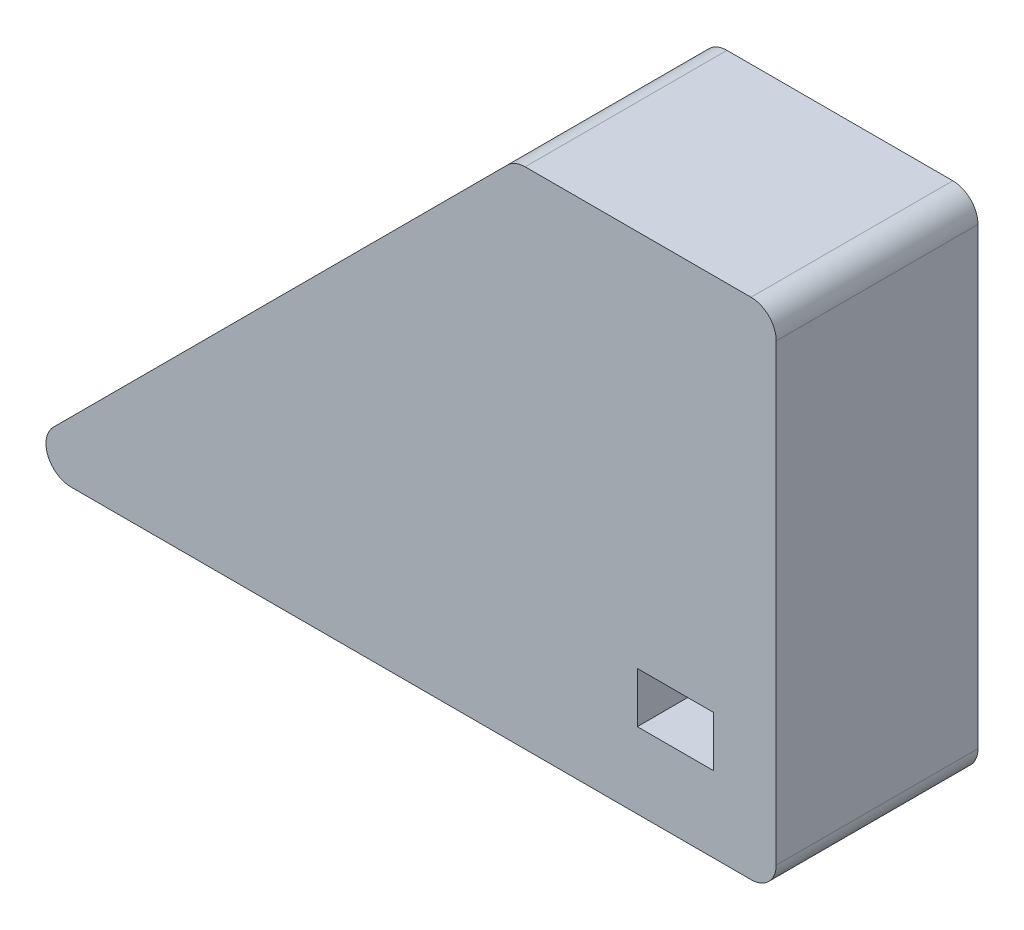
ISO-10303-21;
HEADER;
FILE_DESCRIPTION(('STEP AP214'),'2;1');
FILE_NAME('part.step','',(''),(''),'','','');
FILE_SCHEMA(('AUTOMOTIVE_DESIGN { 1 0 10303 214 1 1 1 1 }'));
ENDSEC;
DATA;
#1=APPLICATION_CONTEXT('core data for automotive mechanical design processes');
#2=APPLICATION_PROTOCOL_DEFINITION('international standard','automotive_design',2000,#1);
#3=PRODUCT_CONTEXT('',#1,'mechanical');
#4=PRODUCT('Part','Part','',(#3));
#5=PRODUCT_RELATED_PRODUCT_CATEGORY('part','',(#4));
#6=PRODUCT_DEFINITION_FORMATION('','',#4);
#7=PRODUCT_DEFINITION_CONTEXT('part definition',#1,'design');
#8=PRODUCT_DEFINITION('design','',#6,#7);
#9=PRODUCT_DEFINITION_SHAPE('','',#8);
#10=(LENGTH_UNIT() NAMED_UNIT(*) SI_UNIT(.MILLI.,.METRE.));
#11=(NAMED_UNIT(*) PLANE_ANGLE_UNIT() SI_UNIT($,.RADIAN.));
#12=(NAMED_UNIT(*) SI_UNIT($,.STERADIAN.) SOLID_ANGLE_UNIT());
#13=UNCERTAINTY_MEASURE_WITH_UNIT(LENGTH_MEASURE(1.E-05),#10,'distance_accuracy_value','');
#14=(GEOMETRIC_REPRESENTATION_CONTEXT(3) GLOBAL_UNCERTAINTY_ASSIGNED_CONTEXT((#13)) GLOBAL_UNIT_ASSIGNED_CONTEXT((#10,
#11,#12)) REPRESENTATION_CONTEXT('',''));
#15=CARTESIAN_POINT('',(0.,0.,0.));
#16=DIRECTION('',(0.,0.,1.));
#17=DIRECTION('',(1.,0.,0.));
#18=AXIS2_PLACEMENT_3D('',#15,#16,#17);
#19=CARTESIAN_POINT('',(13.87348,25.4,-12.7));
#20=DIRECTION('',(0.,-1.,0.));
#21=DIRECTION('',(1.,0.,0.));
#22=AXIS2_PLACEMENT_3D('',#19,#20,#21);
#23=CYLINDRICAL_SURFACE('',#22,2.4892);
#24=CARTESIAN_POINT('',(13.87348,0.,-12.7));
#25=DIRECTION('',(0.,-1.,0.));
#26=DIRECTION('',(1.,0.,0.));
#27=AXIS2_PLACEMENT_3D('',#24,#25,#26);
#28=CIRCLE('',#27,2.4892);
#29=CARTESIAN_POINT('',(16.36268,0.,-12.7));
#30=VERTEX_POINT('',#29);
#31=EDGE_CURVE('E204',#30,#30,#28,.T.);
#32=ORIENTED_EDGE('',*,*,#31,.T.);
#33=EDGE_LOOP('',(#32));
#34=FACE_BOUND('',#33,.T.);
#35=CARTESIAN_POINT('',(13.87348,8.89000000000004,-12.7));
#36=DIRECTION('',(0.,1.,0.));
#37=DIRECTION('',(0.,0.,1.));
#38=AXIS2_PLACEMENT_3D('',#35,#36,#37);
#39=CIRCLE('',#38,2.4892);
#40=CARTESIAN_POINT('',(13.87348,8.89000000000004,-10.2108));
#41=VERTEX_POINT('',#40);
#42=EDGE_CURVE('E246',#41,#41,#39,.F.);
#43=ORIENTED_EDGE('',*,*,#42,.F.);
#44=EDGE_LOOP('',(#43));
#45=FACE_BOUND('',#44,.T.);
#46=ADVANCED_FACE('F45',(#34,#45),#23,.F.);
#47=CARTESIAN_POINT('',(83.72348,25.4,-12.7));
#48=DIRECTION('',(0.,-1.,0.));
#49=DIRECTION('',(1.,0.,0.));
#50=AXIS2_PLACEMENT_3D('',#47,#48,#49);
#51=CYLINDRICAL_SURFACE('',#50,2.4892);
#52=CARTESIAN_POINT('',(83.72348,9.525,-12.7));
#53=DIRECTION('',(0.,-1.,0.));
#54=DIRECTION('',(0.,0.,-1.));
#55=AXIS2_PLACEMENT_3D('',#52,#53,#54);
#56=CIRCLE('',#55,2.4892);
#57=CARTESIAN_POINT('',(83.72348,9.525,-15.1892));
#58=VERTEX_POINT('',#57);
#59=EDGE_CURVE('E208',#58,#58,#56,.F.);
#60=ORIENTED_EDGE('',*,*,#59,.T.);
#61=EDGE_LOOP('',(#60));
#62=FACE_BOUND('',#61,.T.);
#63=CARTESIAN_POINT('',(83.72348,0.,-12.7));
#64=DIRECTION('',(0.,-1.,0.));
#65=DIRECTION('',(1.,0.,0.));
#66=AXIS2_PLACEMENT_3D('',#63,#64,#65);
#67=CIRCLE('',#66,2.4892);
#68=CARTESIAN_POINT('',(86.21268,0.,-12.7));
#69=VERTEX_POINT('',#68);
#70=EDGE_CURVE('E200',#69,#69,#67,.T.);
#71=ORIENTED_EDGE('',*,*,#70,.T.);
#72=EDGE_LOOP('',(#71));
#73=FACE_BOUND('',#72,.T.);
#74=ADVANCED_FACE('F337',(#62,#73),#51,.F.);
#75=CARTESIAN_POINT('',(96.42348,0.,-25.4));
#76=DIRECTION('',(0.,-1.,0.));
#77=DIRECTION('',(1.,0.,0.));
#78=AXIS2_PLACEMENT_3D('',#75,#76,#77);
#79=PLANE('',#78);
#80=ORIENTED_EDGE('',*,*,#70,.F.);
#81=EDGE_LOOP('',(#80));
#82=FACE_BOUND('',#81,.T.);
#83=ORIENTED_EDGE('',*,*,#31,.F.);
#84=EDGE_LOOP('',(#83));
#85=FACE_BOUND('',#84,.T.);
#86=DIRECTION('',(1.,0.,0.));
#87=VECTOR('',#86,1.);
#88=CARTESIAN_POINT('',(96.42348,0.,-25.4));
#89=LINE('',#88,#87);
#90=CARTESIAN_POINT('',(7.66512806053463,0.,-25.4));
#91=VERTEX_POINT('',#90);
#92=CARTESIAN_POINT('',(93.24848,0.,-25.4));
#93=VERTEX_POINT('',#92);
#94=EDGE_CURVE('E209',#91,#93,#89,.T.);
#95=ORIENTED_EDGE('',*,*,#94,.T.);
#96=DIRECTION('',(0.,0.,1.));
#97=VECTOR('',#96,1.);
#98=CARTESIAN_POINT('',(93.24848,0.,-25.4));
#99=LINE('',#98,#97);
#100=CARTESIAN_POINT('',(93.24848,0.,0.));
#101=VERTEX_POINT('',#100);
#102=EDGE_CURVE('E292',#93,#101,#99,.T.);
#103=ORIENTED_EDGE('',*,*,#102,.T.);
#104=DIRECTION('',(1.,0.,0.));
#105=VECTOR('',#104,1.);
#106=CARTESIAN_POINT('',(96.42348,0.,0.));
#107=LINE('',#106,#105);
#108=CARTESIAN_POINT('',(7.66512806053463,0.,0.));
#109=VERTEX_POINT('',#108);
#110=EDGE_CURVE('E199',#109,#101,#107,.T.);
#111=ORIENTED_EDGE('',*,*,#110,.F.);
#112=DIRECTION('',(0.,0.,1.));
#113=VECTOR('',#112,1.);
#114=CARTESIAN_POINT('',(7.66512806053463,0.,-25.4));
#115=LINE('',#114,#113);
#116=EDGE_CURVE('E289',#109,#91,#115,.F.);
#117=ORIENTED_EDGE('',*,*,#116,.T.);
#118=EDGE_LOOP('',(#95,#103,#111,#117));
#119=FACE_BOUND('',#118,.T.);
#120=ADVANCED_FACE('F299',(#82,#85,#119),#79,.T.);
#121=CARTESIAN_POINT('',(0.,0.,-25.4));
#122=DIRECTION('',(-0.707106781186544,0.707106781186551,0.));
#123=DIRECTION('',(-0.707106781186551,-0.707106781186544,0.));
#124=AXIS2_PLACEMENT_3D('',#121,#122,#123);
#125=PLANE('',#124);
#126=CARTESIAN_POINT('',(13.87348,13.8734799999999,-12.7));
#127=DIRECTION('',(-0.707106781186544,0.707106781186551,0.));
#128=DIRECTION('',(0.707106781186551,0.707106781186544,0.));
#129=AXIS2_PLACEMENT_3D('',#126,#127,#128);
#130=ELLIPSE('',#129,6.77111311528612,4.78790000000001);
#131=CARTESIAN_POINT('',(18.66138,18.6613799999998,-12.7));
#132=VERTEX_POINT('',#131);
#133=EDGE_CURVE('E180',#132,#132,#130,.T.);
#134=ORIENTED_EDGE('',*,*,#133,.F.);
#135=EDGE_LOOP('',(#134));
#136=FACE_BOUND('',#135,.T.);
#137=DIRECTION('',(-0.707106781186551,-0.707106781186544,0.));
#138=VECTOR('',#137,1.);
#139=CARTESIAN_POINT('',(0.,0.,-25.4));
#140=LINE('',#139,#138);
#141=CARTESIAN_POINT('',(62.570064030268,62.5700640302673,-25.4));
#142=VERTEX_POINT('',#141);
#143=CARTESIAN_POINT('',(5.42006403026736,5.4200640302673,-25.4));
#144=VERTEX_POINT('',#143);
#145=EDGE_CURVE('E222',#142,#144,#140,.T.);
#146=ORIENTED_EDGE('',*,*,#145,.T.);
#147=DIRECTION('',(0.,0.,1.));
#148=VECTOR('',#147,1.);
#149=CARTESIAN_POINT('',(5.42006403026736,5.4200640302673,-25.4));
#150=LINE('',#149,#148);
#151=CARTESIAN_POINT('',(5.42006403026736,5.4200640302673,0.));
#152=VERTEX_POINT('',#151);
#153=EDGE_CURVE('E11',#144,#152,#150,.T.);
#154=ORIENTED_EDGE('',*,*,#153,.T.);
#155=DIRECTION('',(-0.707106781186551,-0.707106781186544,0.));
#156=VECTOR('',#155,1.);
#157=CARTESIAN_POINT('',(0.,0.,0.));
#158=LINE('',#157,#156);
#159=CARTESIAN_POINT('',(62.570064030268,62.5700640302673,0.));
#160=VERTEX_POINT('',#159);
#161=EDGE_CURVE('E214',#160,#152,#158,.T.);
#162=ORIENTED_EDGE('',*,*,#161,.F.);
#163=DIRECTION('',(0.,0.,1.));
#164=VECTOR('',#163,1.);
#165=CARTESIAN_POINT('',(62.570064030268,62.5700640302673,-25.4));
#166=LINE('',#165,#164);
#167=EDGE_CURVE('E54',#160,#142,#166,.F.);
#168=ORIENTED_EDGE('',*,*,#167,.T.);
#169=EDGE_LOOP('',(#146,#154,#162,#168));
#170=FACE_BOUND('',#169,.T.);
#171=ADVANCED_FACE('F309',(#136,#170),#125,.T.);
#172=CARTESIAN_POINT('',(63.5000000000007,63.5,-25.4));
#173=DIRECTION('',(0.,1.,0.));
#174=DIRECTION('',(0.,0.,1.));
#175=AXIS2_PLACEMENT_3D('',#172,#173,#174);
#176=PLANE('',#175);
#177=DIRECTION('',(-1.,0.,0.));
#178=VECTOR('',#177,1.);
#179=CARTESIAN_POINT('',(63.5000000000007,63.5,0.));
#180=LINE('',#179,#178);
#181=CARTESIAN_POINT('',(93.24848,63.5,0.));
#182=VERTEX_POINT('',#181);
#183=CARTESIAN_POINT('',(64.8151280605352,63.5,0.));
#184=VERTEX_POINT('',#183);
#185=EDGE_CURVE('E233',#182,#184,#180,.T.);
#186=ORIENTED_EDGE('',*,*,#185,.F.);
#187=DIRECTION('',(0.,0.,1.));
#188=VECTOR('',#187,1.);
#189=CARTESIAN_POINT('',(93.24848,63.5,-25.4));
#190=LINE('',#189,#188);
#191=CARTESIAN_POINT('',(93.24848,63.5,-25.4));
#192=VERTEX_POINT('',#191);
#193=EDGE_CURVE('E275',#182,#192,#190,.F.);
#194=ORIENTED_EDGE('',*,*,#193,.T.);
#195=DIRECTION('',(-1.,0.,0.));
#196=VECTOR('',#195,1.);
#197=CARTESIAN_POINT('',(63.5000000000007,63.5,-25.4));
#198=LINE('',#197,#196);
#199=CARTESIAN_POINT('',(64.8151280605352,63.5,-25.4));
#200=VERTEX_POINT('',#199);
#201=EDGE_CURVE('E218',#192,#200,#198,.T.);
#202=ORIENTED_EDGE('',*,*,#201,.T.);
#203=DIRECTION('',(0.,0.,1.));
#204=VECTOR('',#203,1.);
#205=CARTESIAN_POINT('',(64.8151280605352,63.5,-25.4));
#206=LINE('',#205,#204);
#207=EDGE_CURVE('E271',#200,#184,#206,.T.);
#208=ORIENTED_EDGE('',*,*,#207,.T.);
#209=EDGE_LOOP('',(#186,#194,#202,#208));
#210=FACE_BOUND('',#209,.T.);
#211=ADVANCED_FACE('F317',(#210),#176,.T.);
#212=CARTESIAN_POINT('',(96.42348,63.5,-25.4));
#213=DIRECTION('',(1.,0.,0.));
#214=DIRECTION('',(0.,1.,0.));
#215=AXIS2_PLACEMENT_3D('',#212,#213,#214);
#216=PLANE('',#215);
#217=DIRECTION('',(0.,1.,0.));
#218=VECTOR('',#217,1.);
#219=CARTESIAN_POINT('',(96.42348,63.5,-25.4));
#220=LINE('',#219,#218);
#221=CARTESIAN_POINT('',(96.42348,3.175,-25.4));
#222=VERTEX_POINT('',#221);
#223=CARTESIAN_POINT('',(96.42348,60.325,-25.4));
#224=VERTEX_POINT('',#223);
#225=EDGE_CURVE('E213',#222,#224,#220,.T.);
#226=ORIENTED_EDGE('',*,*,#225,.T.);
#227=DIRECTION('',(0.,0.,1.));
#228=VECTOR('',#227,1.);
#229=CARTESIAN_POINT('',(96.42348,60.325,-25.4));
#230=LINE('',#229,#228);
#231=CARTESIAN_POINT('',(96.42348,60.325,0.));
#232=VERTEX_POINT('',#231);
#233=EDGE_CURVE('E255',#224,#232,#230,.T.);
#234=ORIENTED_EDGE('',*,*,#233,.T.);
#235=DIRECTION('',(0.,1.,0.));
#236=VECTOR('',#235,1.);
#237=CARTESIAN_POINT('',(96.42348,63.5,0.));
#238=LINE('',#237,#236);
#239=CARTESIAN_POINT('',(96.42348,3.175,0.));
#240=VERTEX_POINT('',#239);
#241=EDGE_CURVE('E229',#240,#232,#238,.T.);
#242=ORIENTED_EDGE('',*,*,#241,.F.);
#243=DIRECTION('',(0.,0.,1.));
#244=VECTOR('',#243,1.);
#245=CARTESIAN_POINT('',(96.42348,3.175,-25.4));
#246=LINE('',#245,#244);
#247=EDGE_CURVE('E225',#240,#222,#246,.F.);
#248=ORIENTED_EDGE('',*,*,#247,.T.);
#249=EDGE_LOOP('',(#226,#234,#242,#248));
#250=FACE_BOUND('',#249,.T.);
#251=ADVANCED_FACE('F324',(#250),#216,.T.);
#252=CARTESIAN_POINT('',(0.,0.,-25.4));
#253=DIRECTION('',(0.,0.,1.));
#254=DIRECTION('',(1.,0.,0.));
#255=AXIS2_PLACEMENT_3D('',#252,#253,#254);
#256=PLANE('',#255);
#257=ORIENTED_EDGE('',*,*,#201,.F.);
#258=CARTESIAN_POINT('',(93.24848,60.325,-25.4));
#259=DIRECTION('',(0.,0.,1.));
#260=DIRECTION('',(1.,0.,0.));
#261=AXIS2_PLACEMENT_3D('',#258,#259,#260);
#262=CIRCLE('',#261,3.175);
#263=EDGE_CURVE('E286',#192,#224,#262,.F.);
#264=ORIENTED_EDGE('',*,*,#263,.T.);
#265=ORIENTED_EDGE('',*,*,#225,.F.);
#266=CARTESIAN_POINT('',(93.24848,3.175,-25.4));
#267=DIRECTION('',(0.,0.,1.));
#268=DIRECTION('',(1.,0.,0.));
#269=AXIS2_PLACEMENT_3D('',#266,#267,#268);
#270=CIRCLE('',#269,3.175);
#271=EDGE_CURVE('E283',#222,#93,#270,.F.);
#272=ORIENTED_EDGE('',*,*,#271,.T.);
#273=ORIENTED_EDGE('',*,*,#94,.F.);
#274=CARTESIAN_POINT('',(7.66512806053463,3.175,-25.4));
#275=DIRECTION('',(0.,0.,1.));
#276=DIRECTION('',(1.,0.,0.));
#277=AXIS2_PLACEMENT_3D('',#274,#275,#276);
#278=CIRCLE('',#277,3.175);
#279=EDGE_CURVE('E61',#91,#144,#278,.F.);
#280=ORIENTED_EDGE('',*,*,#279,.T.);
#281=ORIENTED_EDGE('',*,*,#145,.F.);
#282=CARTESIAN_POINT('',(64.8151280605352,60.325,-25.4));
#283=DIRECTION('',(0.,0.,1.));
#284=DIRECTION('',(1.,0.,0.));
#285=AXIS2_PLACEMENT_3D('',#282,#283,#284);
#286=CIRCLE('',#285,3.175);
#287=EDGE_CURVE('E278',#142,#200,#286,.F.);
#288=ORIENTED_EDGE('',*,*,#287,.T.);
#289=EDGE_LOOP('',(#257,#264,#265,#272,#273,#280,#281,#288));
#290=FACE_BOUND('',#289,.T.);
#291=ADVANCED_FACE('F312',(#290),#256,.F.);
#292=CARTESIAN_POINT('',(0.,0.,0.));
#293=DIRECTION('',(0.,0.,1.));
#294=DIRECTION('',(1.,0.,0.));
#295=AXIS2_PLACEMENT_3D('',#292,#293,#294);
#296=PLANE('',#295);
#297=DIRECTION('',(0.,1.,0.));
#298=VECTOR('',#297,1.);
#299=CARTESIAN_POINT('',(88.51138,15.875,0.));
#300=LINE('',#299,#298);
#301=CARTESIAN_POINT('',(88.51138,9.525,0.));
#302=VERTEX_POINT('',#301);
#303=CARTESIAN_POINT('',(88.51138,15.875,0.));
#304=VERTEX_POINT('',#303);
#305=EDGE_CURVE('E143',#302,#304,#300,.T.);
#306=ORIENTED_EDGE('',*,*,#305,.F.);
#307=DIRECTION('',(1.,0.,0.));
#308=VECTOR('',#307,1.);
#309=CARTESIAN_POINT('',(78.93558,9.525,0.));
#310=LINE('',#309,#308);
#311=CARTESIAN_POINT('',(78.93558,9.525,0.));
#312=VERTEX_POINT('',#311);
#313=EDGE_CURVE('E164',#312,#302,#310,.T.);
#314=ORIENTED_EDGE('',*,*,#313,.F.);
#315=DIRECTION('',(0.,-1.,0.));
#316=VECTOR('',#315,1.);
#317=CARTESIAN_POINT('',(78.93558,15.875,0.));
#318=LINE('',#317,#316);
#319=CARTESIAN_POINT('',(78.93558,15.875,0.));
#320=VERTEX_POINT('',#319);
#321=EDGE_CURVE('E168',#320,#312,#318,.T.);
#322=ORIENTED_EDGE('',*,*,#321,.F.);
#323=DIRECTION('',(-1.,0.,0.));
#324=VECTOR('',#323,1.);
#325=CARTESIAN_POINT('',(78.93558,15.875,0.));
#326=LINE('',#325,#324);
#327=EDGE_CURVE('E179',#304,#320,#326,.T.);
#328=ORIENTED_EDGE('',*,*,#327,.F.);
#329=EDGE_LOOP('',(#306,#314,#322,#328));
#330=FACE_BOUND('',#329,.T.);
#331=ORIENTED_EDGE('',*,*,#241,.T.);
#332=CARTESIAN_POINT('',(93.24848,60.325,0.));
#333=DIRECTION('',(0.,0.,1.));
#334=DIRECTION('',(1.,0.,0.));
#335=AXIS2_PLACEMENT_3D('',#332,#333,#334);
#336=CIRCLE('',#335,3.175);
#337=EDGE_CURVE('E268',#232,#182,#336,.T.);
#338=ORIENTED_EDGE('',*,*,#337,.T.);
#339=ORIENTED_EDGE('',*,*,#185,.T.);
#340=CARTESIAN_POINT('',(64.8151280605352,60.325,0.));
#341=DIRECTION('',(0.,0.,1.));
#342=DIRECTION('',(1.,0.,0.));
#343=AXIS2_PLACEMENT_3D('',#340,#341,#342);
#344=CIRCLE('',#343,3.175);
#345=EDGE_CURVE('E259',#184,#160,#344,.T.);
#346=ORIENTED_EDGE('',*,*,#345,.T.);
#347=ORIENTED_EDGE('',*,*,#161,.T.);
#348=CARTESIAN_POINT('',(7.66512806053463,3.175,0.));
#349=DIRECTION('',(0.,0.,1.));
#350=DIRECTION('',(1.,0.,0.));
#351=AXIS2_PLACEMENT_3D('',#348,#349,#350);
#352=CIRCLE('',#351,3.175);
#353=EDGE_CURVE('E262',#152,#109,#352,.T.);
#354=ORIENTED_EDGE('',*,*,#353,.T.);
#355=ORIENTED_EDGE('',*,*,#110,.T.);
#356=CARTESIAN_POINT('',(93.24848,3.175,0.));
#357=DIRECTION('',(0.,0.,1.));
#358=DIRECTION('',(1.,0.,0.));
#359=AXIS2_PLACEMENT_3D('',#356,#357,#358);
#360=CIRCLE('',#359,3.175);
#361=EDGE_CURVE('E265',#101,#240,#360,.T.);
#362=ORIENTED_EDGE('',*,*,#361,.T.);
#363=EDGE_LOOP('',(#331,#338,#339,#346,#347,#354,#355,#362));
#364=FACE_BOUND('',#363,.T.);
#365=ADVANCED_FACE('F304',(#330,#364),#296,.T.);
#366=CARTESIAN_POINT('',(78.93558,9.525,-17.5133));
#367=DIRECTION('',(0.,-1.,0.));
#368=DIRECTION('',(0.,0.,-1.));
#369=AXIS2_PLACEMENT_3D('',#366,#367,#368);
#370=PLANE('',#369);
#371=ORIENTED_EDGE('',*,*,#313,.T.);
#372=DIRECTION('',(0.,0.,1.));
#373=VECTOR('',#372,1.);
#374=CARTESIAN_POINT('',(88.51138,9.525,-17.5133));
#375=LINE('',#374,#373);
#376=CARTESIAN_POINT('',(88.51138,9.525,-17.5133));
#377=VERTEX_POINT('',#376);
#378=EDGE_CURVE('E186',#377,#302,#375,.T.);
#379=ORIENTED_EDGE('',*,*,#378,.F.);
#380=DIRECTION('',(1.,0.,0.));
#381=VECTOR('',#380,1.);
#382=CARTESIAN_POINT('',(78.93558,9.525,-17.5133));
#383=LINE('',#382,#381);
#384=CARTESIAN_POINT('',(78.93558,9.525,-17.5133));
#385=VERTEX_POINT('',#384);
#386=EDGE_CURVE('E149',#385,#377,#383,.T.);
#387=ORIENTED_EDGE('',*,*,#386,.F.);
#388=DIRECTION('',(0.,0.,1.));
#389=VECTOR('',#388,1.);
#390=CARTESIAN_POINT('',(78.93558,9.525,-17.5133));
#391=LINE('',#390,#389);
#392=EDGE_CURVE('E190',#385,#312,#391,.T.);
#393=ORIENTED_EDGE('',*,*,#392,.T.);
#394=EDGE_LOOP('',(#371,#379,#387,#393));
#395=FACE_BOUND('',#394,.T.);
#396=ORIENTED_EDGE('',*,*,#59,.F.);
#397=EDGE_LOOP('',(#396));
#398=FACE_BOUND('',#397,.T.);
#399=ADVANCED_FACE('F355',(#395,#398),#370,.F.);
#400=CARTESIAN_POINT('',(78.93558,15.875,-17.5133));
#401=DIRECTION('',(0.,1.,0.));
#402=DIRECTION('',(0.,0.,1.));
#403=AXIS2_PLACEMENT_3D('',#400,#401,#402);
#404=PLANE('',#403);
#405=ORIENTED_EDGE('',*,*,#327,.T.);
#406=DIRECTION('',(0.,0.,1.));
#407=VECTOR('',#406,1.);
#408=CARTESIAN_POINT('',(78.93558,15.875,-17.5133));
#409=LINE('',#408,#407);
#410=CARTESIAN_POINT('',(78.93558,15.875,-17.5133));
#411=VERTEX_POINT('',#410);
#412=EDGE_CURVE('E148',#411,#320,#409,.T.);
#413=ORIENTED_EDGE('',*,*,#412,.F.);
#414=DIRECTION('',(-1.,0.,0.));
#415=VECTOR('',#414,1.);
#416=CARTESIAN_POINT('',(78.93558,15.875,-17.5133));
#417=LINE('',#416,#415);
#418=CARTESIAN_POINT('',(88.51138,15.875,-17.5133));
#419=VERTEX_POINT('',#418);
#420=EDGE_CURVE('E152',#419,#411,#417,.T.);
#421=ORIENTED_EDGE('',*,*,#420,.F.);
#422=DIRECTION('',(0.,0.,1.));
#423=VECTOR('',#422,1.);
#424=CARTESIAN_POINT('',(88.51138,15.875,-17.5133));
#425=LINE('',#424,#423);
#426=EDGE_CURVE('E136',#419,#304,#425,.T.);
#427=ORIENTED_EDGE('',*,*,#426,.T.);
#428=EDGE_LOOP('',(#405,#413,#421,#427));
#429=FACE_BOUND('',#428,.T.);
#430=CARTESIAN_POINT('',(83.72348,15.875,-12.7));
#431=DIRECTION('',(0.,1.,0.));
#432=DIRECTION('',(0.,0.,1.));
#433=AXIS2_PLACEMENT_3D('',#430,#431,#432);
#434=CIRCLE('',#433,2.4892);
#435=CARTESIAN_POINT('',(83.72348,15.875,-10.2108));
#436=VERTEX_POINT('',#435);
#437=EDGE_CURVE('E189',#436,#436,#434,.F.);
#438=ORIENTED_EDGE('',*,*,#437,.F.);
#439=EDGE_LOOP('',(#438));
#440=FACE_BOUND('',#439,.T.);
#441=ADVANCED_FACE('F153',(#429,#440),#404,.F.);
#442=CARTESIAN_POINT('',(88.51138,15.875,-17.5133));
#443=DIRECTION('',(1.,0.,0.));
#444=DIRECTION('',(0.,0.,-1.));
#445=AXIS2_PLACEMENT_3D('',#442,#443,#444);
#446=PLANE('',#445);
#447=ORIENTED_EDGE('',*,*,#305,.T.);
#448=ORIENTED_EDGE('',*,*,#426,.F.);
#449=DIRECTION('',(0.,1.,0.));
#450=VECTOR('',#449,1.);
#451=CARTESIAN_POINT('',(88.51138,15.875,-17.5133));
#452=LINE('',#451,#450);
#453=EDGE_CURVE('E140',#377,#419,#452,.T.);
#454=ORIENTED_EDGE('',*,*,#453,.F.);
#455=ORIENTED_EDGE('',*,*,#378,.T.);
#456=EDGE_LOOP('',(#447,#448,#454,#455));
#457=FACE_BOUND('',#456,.T.);
#458=ADVANCED_FACE('F138',(#457),#446,.F.);
#459=CARTESIAN_POINT('',(78.93558,15.875,-17.5133));
#460=DIRECTION('',(-1.,0.,0.));
#461=DIRECTION('',(0.,0.,1.));
#462=AXIS2_PLACEMENT_3D('',#459,#460,#461);
#463=PLANE('',#462);
#464=ORIENTED_EDGE('',*,*,#321,.T.);
#465=ORIENTED_EDGE('',*,*,#392,.F.);
#466=DIRECTION('',(0.,-1.,0.));
#467=VECTOR('',#466,1.);
#468=CARTESIAN_POINT('',(78.93558,15.875,-17.5133));
#469=LINE('',#468,#467);
#470=EDGE_CURVE('E159',#411,#385,#469,.T.);
#471=ORIENTED_EDGE('',*,*,#470,.F.);
#472=ORIENTED_EDGE('',*,*,#412,.T.);
#473=EDGE_LOOP('',(#464,#465,#471,#472));
#474=FACE_BOUND('',#473,.T.);
#475=ADVANCED_FACE('F453',(#474),#463,.F.);
#476=CARTESIAN_POINT('',(0.,0.,-17.5133));
#477=DIRECTION('',(0.,0.,1.));
#478=DIRECTION('',(1.,0.,0.));
#479=AXIS2_PLACEMENT_3D('',#476,#477,#478);
#480=PLANE('',#479);
#481=ORIENTED_EDGE('',*,*,#453,.T.);
#482=ORIENTED_EDGE('',*,*,#420,.T.);
#483=ORIENTED_EDGE('',*,*,#470,.T.);
#484=ORIENTED_EDGE('',*,*,#386,.T.);
#485=EDGE_LOOP('',(#481,#482,#483,#484));
#486=FACE_BOUND('',#485,.T.);
#487=ADVANCED_FACE('F161',(#486),#480,.T.);
#488=CARTESIAN_POINT('',(83.72348,25.4,-12.7));
#489=DIRECTION('',(0.,-1.,0.));
#490=DIRECTION('',(1.,0.,0.));
#491=AXIS2_PLACEMENT_3D('',#488,#489,#490);
#492=PLANE('',#491);
#493=CARTESIAN_POINT('',(83.72348,25.4,-12.7));
#494=DIRECTION('',(0.,-1.,0.));
#495=DIRECTION('',(1.,0.,0.));
#496=AXIS2_PLACEMENT_3D('',#493,#494,#495);
#497=CIRCLE('',#496,2.4892);
#498=CARTESIAN_POINT('',(86.21268,25.4,-12.7));
#499=VERTEX_POINT('',#498);
#500=EDGE_CURVE('E195',#499,#499,#497,.T.);
#501=ORIENTED_EDGE('',*,*,#500,.T.);
#502=EDGE_LOOP('',(#501));
#503=FACE_BOUND('',#502,.T.);
#504=ADVANCED_FACE('F452',(#503),#492,.T.);
#505=ORIENTED_EDGE('',*,*,#437,.T.);
#506=EDGE_LOOP('',(#505));
#507=FACE_BOUND('',#506,.T.);
#508=ORIENTED_EDGE('',*,*,#500,.F.);
#509=EDGE_LOOP('',(#508));
#510=FACE_BOUND('',#509,.T.);
#511=ADVANCED_FACE('F347',(#507,#510),#51,.F.);
#512=CARTESIAN_POINT('',(13.87348,8.89000000000004,-12.7));
#513=DIRECTION('',(0.,1.,0.));
#514=DIRECTION('',(0.,0.,1.));
#515=AXIS2_PLACEMENT_3D('',#512,#513,#514);
#516=PLANE('',#515);
#517=CARTESIAN_POINT('',(13.87348,8.89000000000004,-12.7));
#518=DIRECTION('',(0.,1.,0.));
#519=DIRECTION('',(0.,0.,1.));
#520=AXIS2_PLACEMENT_3D('',#517,#518,#519);
#521=CIRCLE('',#520,4.78790000000001);
#522=CARTESIAN_POINT('',(13.87348,8.89000000000004,-7.91209999999999));
#523=VERTEX_POINT('',#522);
#524=EDGE_CURVE('E171',#523,#523,#521,.T.);
#525=ORIENTED_EDGE('',*,*,#524,.T.);
#526=EDGE_LOOP('',(#525));
#527=FACE_BOUND('',#526,.T.);
#528=ORIENTED_EDGE('',*,*,#42,.T.);
#529=EDGE_LOOP('',(#528));
#530=FACE_BOUND('',#529,.T.);
#531=ADVANCED_FACE('F431',(#527,#530),#516,.T.);
#532=CARTESIAN_POINT('',(13.87348,8.89000000000004,-12.7));
#533=DIRECTION('',(0.,1.,0.));
#534=DIRECTION('',(0.,0.,1.));
#535=AXIS2_PLACEMENT_3D('',#532,#533,#534);
#536=CYLINDRICAL_SURFACE('',#535,4.78790000000001);
#537=ORIENTED_EDGE('',*,*,#133,.T.);
#538=EDGE_LOOP('',(#537));
#539=FACE_BOUND('',#538,.T.);
#540=ORIENTED_EDGE('',*,*,#524,.F.);
#541=EDGE_LOOP('',(#540));
#542=FACE_BOUND('',#541,.T.);
#543=ADVANCED_FACE('F334',(#539,#542),#536,.F.);
#544=CARTESIAN_POINT('',(93.24848,60.325,-25.4));
#545=DIRECTION('',(0.,0.,1.));
#546=DIRECTION('',(1.,0.,0.));
#547=AXIS2_PLACEMENT_3D('',#544,#545,#546);
#548=CYLINDRICAL_SURFACE('',#547,3.175);
#549=ORIENTED_EDGE('',*,*,#263,.F.);
#550=ORIENTED_EDGE('',*,*,#193,.F.);
#551=ORIENTED_EDGE('',*,*,#337,.F.);
#552=ORIENTED_EDGE('',*,*,#233,.F.);
#553=EDGE_LOOP('',(#549,#550,#551,#552));
#554=FACE_BOUND('',#553,.T.);
#555=ADVANCED_FACE('F322',(#554),#548,.T.);
#556=CARTESIAN_POINT('',(93.24848,3.175,-25.4));
#557=DIRECTION('',(0.,0.,1.));
#558=DIRECTION('',(1.,0.,0.));
#559=AXIS2_PLACEMENT_3D('',#556,#557,#558);
#560=CYLINDRICAL_SURFACE('',#559,3.175);
#561=ORIENTED_EDGE('',*,*,#271,.F.);
#562=ORIENTED_EDGE('',*,*,#247,.F.);
#563=ORIENTED_EDGE('',*,*,#361,.F.);
#564=ORIENTED_EDGE('',*,*,#102,.F.);
#565=EDGE_LOOP('',(#561,#562,#563,#564));
#566=FACE_BOUND('',#565,.T.);
#567=ADVANCED_FACE('F327',(#566),#560,.T.);
#568=CARTESIAN_POINT('',(7.66512806053463,3.175,-25.4));
#569=DIRECTION('',(0.,0.,1.));
#570=DIRECTION('',(1.,0.,0.));
#571=AXIS2_PLACEMENT_3D('',#568,#569,#570);
#572=CYLINDRICAL_SURFACE('',#571,3.175);
#573=ORIENTED_EDGE('',*,*,#279,.F.);
#574=ORIENTED_EDGE('',*,*,#116,.F.);
#575=ORIENTED_EDGE('',*,*,#353,.F.);
#576=ORIENTED_EDGE('',*,*,#153,.F.);
#577=EDGE_LOOP('',(#573,#574,#575,#576));
#578=FACE_BOUND('',#577,.T.);
#579=ADVANCED_FACE('F308',(#578),#572,.T.);
#580=CARTESIAN_POINT('',(64.8151280605352,60.325,-25.4));
#581=DIRECTION('',(0.,0.,1.));
#582=DIRECTION('',(1.,0.,0.));
#583=AXIS2_PLACEMENT_3D('',#580,#581,#582);
#584=CYLINDRICAL_SURFACE('',#583,3.175);
#585=ORIENTED_EDGE('',*,*,#287,.F.);
#586=ORIENTED_EDGE('',*,*,#167,.F.);
#587=ORIENTED_EDGE('',*,*,#345,.F.);
#588=ORIENTED_EDGE('',*,*,#207,.F.);
#589=EDGE_LOOP('',(#585,#586,#587,#588));
#590=FACE_BOUND('',#589,.T.);
#591=ADVANCED_FACE('F47',(#590),#584,.T.);
#592=CLOSED_SHELL('',(#46,#74,#120,#171,#211,#251,#291,#365,#399,#441,#458,#475,#487,#504,#511,
#531,#543,#555,#567,#579,#591));
#593=MANIFOLD_SOLID_BREP('B2',#592);
#594=ADVANCED_BREP_SHAPE_REPRESENTATION('',(#18,#593),#14);
#595=SHAPE_DEFINITION_REPRESENTATION(#9,#594);
ENDSEC;
END-ISO-10303-21;
